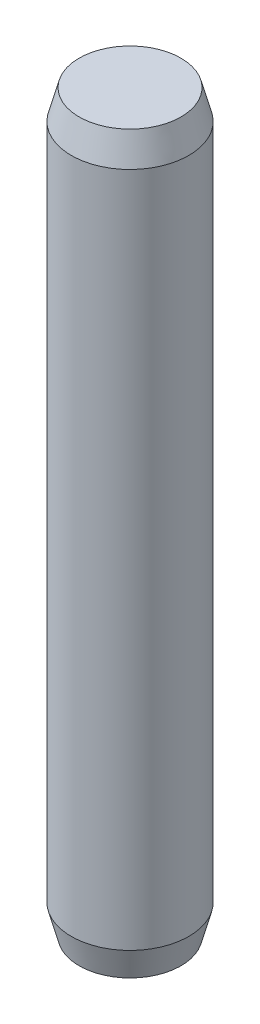
ISO-10303-21;
HEADER;
FILE_DESCRIPTION(('STEP AP214'),'2;1');
FILE_NAME('part.step','',(''),(''),'','','');
FILE_SCHEMA(('AUTOMOTIVE_DESIGN { 1 0 10303 214 1 1 1 1 }'));
ENDSEC;
DATA;
#1=APPLICATION_CONTEXT('core data for automotive mechanical design processes');
#2=APPLICATION_PROTOCOL_DEFINITION('international standard','automotive_design',2000,#1);
#3=PRODUCT_CONTEXT('',#1,'mechanical');
#4=PRODUCT('Part','Part','',(#3));
#5=PRODUCT_RELATED_PRODUCT_CATEGORY('part','',(#4));
#6=PRODUCT_DEFINITION_FORMATION('','',#4);
#7=PRODUCT_DEFINITION_CONTEXT('part definition',#1,'design');
#8=PRODUCT_DEFINITION('design','',#6,#7);
#9=PRODUCT_DEFINITION_SHAPE('','',#8);
#10=(LENGTH_UNIT() NAMED_UNIT(*) SI_UNIT(.MILLI.,.METRE.));
#11=(NAMED_UNIT(*) PLANE_ANGLE_UNIT() SI_UNIT($,.RADIAN.));
#12=(NAMED_UNIT(*) SI_UNIT($,.STERADIAN.) SOLID_ANGLE_UNIT());
#13=UNCERTAINTY_MEASURE_WITH_UNIT(LENGTH_MEASURE(1.E-05),#10,'distance_accuracy_value','');
#14=(GEOMETRIC_REPRESENTATION_CONTEXT(3) GLOBAL_UNCERTAINTY_ASSIGNED_CONTEXT((#13)) GLOBAL_UNIT_ASSIGNED_CONTEXT((#10,
#11,#12)) REPRESENTATION_CONTEXT('',''));
#15=CARTESIAN_POINT('',(0.,0.,0.));
#16=DIRECTION('',(0.,0.,1.));
#17=DIRECTION('',(1.,0.,0.));
#18=AXIS2_PLACEMENT_3D('',#15,#16,#17);
#19=CARTESIAN_POINT('',(0.,25.,0.));
#20=DIRECTION('',(0.,1.,0.));
#21=DIRECTION('',(0.,0.,1.));
#22=AXIS2_PLACEMENT_3D('',#19,#20,#21);
#23=PLANE('',#22);
#24=CARTESIAN_POINT('',(0.,25.,0.));
#25=DIRECTION('',(0.,-1.,0.));
#26=DIRECTION('',(0.,0.,-1.));
#27=AXIS2_PLACEMENT_3D('',#24,#25,#26);
#28=CIRCLE('',#27,1.73205080756888);
#29=CARTESIAN_POINT('',(0.,25.,-1.73205080756888));
#30=VERTEX_POINT('',#29);
#31=EDGE_CURVE('E10',#30,#30,#28,.T.);
#32=ORIENTED_EDGE('',*,*,#31,.F.);
#33=EDGE_LOOP('',(#32));
#34=FACE_BOUND('',#33,.T.);
#35=ADVANCED_FACE('F38',(#34),#23,.T.);
#36=CARTESIAN_POINT('',(0.,24.,0.));
#37=DIRECTION('',(0.,-1.,0.));
#38=DIRECTION('',(0.,0.,-1.));
#39=AXIS2_PLACEMENT_3D('',#36,#37,#38);
#40=CONICAL_SURFACE('',#39,2.,0.261799387799143);
#41=ORIENTED_EDGE('',*,*,#31,.T.);
#42=EDGE_LOOP('',(#41));
#43=FACE_BOUND('',#42,.T.);
#44=CARTESIAN_POINT('',(0.,24.,0.));
#45=DIRECTION('',(0.,-1.,0.));
#46=DIRECTION('',(0.,0.,-1.));
#47=AXIS2_PLACEMENT_3D('',#44,#45,#46);
#48=CIRCLE('',#47,2.);
#49=CARTESIAN_POINT('',(0.,24.,-2.));
#50=VERTEX_POINT('',#49);
#51=EDGE_CURVE('E44',#50,#50,#48,.T.);
#52=ORIENTED_EDGE('',*,*,#51,.F.);
#53=EDGE_LOOP('',(#52));
#54=FACE_BOUND('',#53,.T.);
#55=ADVANCED_FACE('F70',(#43,#54),#40,.T.);
#56=CARTESIAN_POINT('',(0.,0.,0.));
#57=DIRECTION('',(0.,-1.,0.));
#58=DIRECTION('',(0.,0.,-1.));
#59=AXIS2_PLACEMENT_3D('',#56,#57,#58);
#60=CYLINDRICAL_SURFACE('',#59,2.);
#61=ORIENTED_EDGE('',*,*,#51,.T.);
#62=EDGE_LOOP('',(#61));
#63=FACE_BOUND('',#62,.T.);
#64=CARTESIAN_POINT('',(0.,1.,0.));
#65=DIRECTION('',(0.,-1.,0.));
#66=DIRECTION('',(0.,0.,-1.));
#67=AXIS2_PLACEMENT_3D('',#64,#65,#66);
#68=CIRCLE('',#67,2.);
#69=CARTESIAN_POINT('',(0.,1.,-2.));
#70=VERTEX_POINT('',#69);
#71=EDGE_CURVE('E48',#70,#70,#68,.T.);
#72=ORIENTED_EDGE('',*,*,#71,.F.);
#73=EDGE_LOOP('',(#72));
#74=FACE_BOUND('',#73,.T.);
#75=ADVANCED_FACE('F62',(#63,#74),#60,.T.);
#76=CARTESIAN_POINT('',(0.,0.,0.));
#77=DIRECTION('',(0.,1.,0.));
#78=DIRECTION('',(0.,0.,1.));
#79=AXIS2_PLACEMENT_3D('',#76,#77,#78);
#80=CONICAL_SURFACE('',#79,1.73205080756888,0.261799387799146);
#81=ORIENTED_EDGE('',*,*,#71,.T.);
#82=EDGE_LOOP('',(#81));
#83=FACE_BOUND('',#82,.T.);
#84=CARTESIAN_POINT('',(0.,0.,0.));
#85=DIRECTION('',(0.,-1.,0.));
#86=DIRECTION('',(0.,0.,-1.));
#87=AXIS2_PLACEMENT_3D('',#84,#85,#86);
#88=CIRCLE('',#87,1.73205080756888);
#89=CARTESIAN_POINT('',(0.,0.,-1.73205080756888));
#90=VERTEX_POINT('',#89);
#91=EDGE_CURVE('E52',#90,#90,#88,.T.);
#92=ORIENTED_EDGE('',*,*,#91,.F.);
#93=EDGE_LOOP('',(#92));
#94=FACE_BOUND('',#93,.T.);
#95=ADVANCED_FACE('F60',(#83,#94),#80,.T.);
#96=CARTESIAN_POINT('',(0.,0.,0.));
#97=DIRECTION('',(0.,-1.,0.));
#98=DIRECTION('',(0.,0.,-1.));
#99=AXIS2_PLACEMENT_3D('',#96,#97,#98);
#100=PLANE('',#99);
#101=ORIENTED_EDGE('',*,*,#91,.T.);
#102=EDGE_LOOP('',(#101));
#103=FACE_BOUND('',#102,.T.);
#104=ADVANCED_FACE('F58',(#103),#100,.T.);
#105=CLOSED_SHELL('',(#35,#55,#75,#95,#104));
#106=MANIFOLD_SOLID_BREP('B2',#105);
#107=ADVANCED_BREP_SHAPE_REPRESENTATION('',(#18,#106),#14);
#108=SHAPE_DEFINITION_REPRESENTATION(#9,#107);
ENDSEC;
END-ISO-10303-21;
